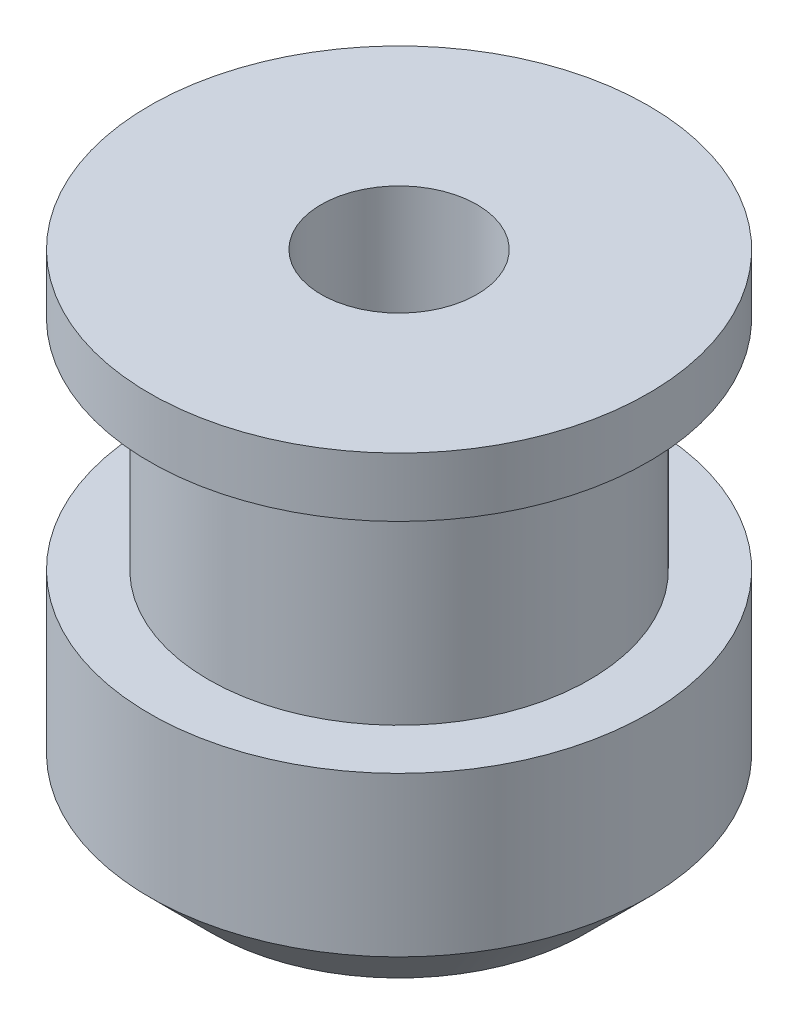
ISO-10303-21;
HEADER;
FILE_DESCRIPTION(('STEP AP214'),'2;1');
FILE_NAME('part.step','',(''),(''),'','','');
FILE_SCHEMA(('AUTOMOTIVE_DESIGN { 1 0 10303 214 1 1 1 1 }'));
ENDSEC;
DATA;
#1=APPLICATION_CONTEXT('core data for automotive mechanical design processes');
#2=APPLICATION_PROTOCOL_DEFINITION('international standard','automotive_design',2000,#1);
#3=PRODUCT_CONTEXT('',#1,'mechanical');
#4=PRODUCT('Part','Part','',(#3));
#5=PRODUCT_RELATED_PRODUCT_CATEGORY('part','',(#4));
#6=PRODUCT_DEFINITION_FORMATION('','',#4);
#7=PRODUCT_DEFINITION_CONTEXT('part definition',#1,'design');
#8=PRODUCT_DEFINITION('design','',#6,#7);
#9=PRODUCT_DEFINITION_SHAPE('','',#8);
#10=(LENGTH_UNIT() NAMED_UNIT(*) SI_UNIT(.MILLI.,.METRE.));
#11=(NAMED_UNIT(*) PLANE_ANGLE_UNIT() SI_UNIT($,.RADIAN.));
#12=(NAMED_UNIT(*) SI_UNIT($,.STERADIAN.) SOLID_ANGLE_UNIT());
#13=UNCERTAINTY_MEASURE_WITH_UNIT(LENGTH_MEASURE(1.E-05),#10,'distance_accuracy_value','');
#14=(GEOMETRIC_REPRESENTATION_CONTEXT(3) GLOBAL_UNCERTAINTY_ASSIGNED_CONTEXT((#13)) GLOBAL_UNIT_ASSIGNED_CONTEXT((#10,
#11,#12)) REPRESENTATION_CONTEXT('',''));
#15=CARTESIAN_POINT('',(0.,0.,0.));
#16=DIRECTION('',(0.,0.,1.));
#17=DIRECTION('',(1.,0.,0.));
#18=AXIS2_PLACEMENT_3D('',#15,#16,#17);
#19=CARTESIAN_POINT('',(0.,0.,0.));
#20=DIRECTION('',(0.,-1.,0.));
#21=DIRECTION('',(0.,0.,-1.));
#22=AXIS2_PLACEMENT_3D('',#19,#20,#21);
#23=CYLINDRICAL_SURFACE('',#22,2.5);
#24=CARTESIAN_POINT('',(0.,0.,0.));
#25=DIRECTION('',(0.,-1.,0.));
#26=DIRECTION('',(0.,0.,-1.));
#27=AXIS2_PLACEMENT_3D('',#24,#25,#26);
#28=CIRCLE('',#27,2.5);
#29=CARTESIAN_POINT('',(0.,0.,-2.5));
#30=VERTEX_POINT('',#29);
#31=EDGE_CURVE('E50',#30,#30,#28,.T.);
#32=ORIENTED_EDGE('',*,*,#31,.T.);
#33=EDGE_LOOP('',(#32));
#34=FACE_BOUND('',#33,.T.);
#35=CARTESIAN_POINT('',(0.,16.,0.));
#36=DIRECTION('',(0.,-1.,0.));
#37=DIRECTION('',(0.,0.,-1.));
#38=AXIS2_PLACEMENT_3D('',#35,#36,#37);
#39=CIRCLE('',#38,2.5);
#40=CARTESIAN_POINT('',(0.,16.,-2.5));
#41=VERTEX_POINT('',#40);
#42=EDGE_CURVE('E71',#41,#41,#39,.T.);
#43=ORIENTED_EDGE('',*,*,#42,.F.);
#44=EDGE_LOOP('',(#43));
#45=FACE_BOUND('',#44,.T.);
#46=ADVANCED_FACE('F38',(#34,#45),#23,.F.);
#47=CARTESIAN_POINT('',(2.5,0.,0.));
#48=DIRECTION('',(0.,-1.,0.));
#49=DIRECTION('',(0.,0.,-1.));
#50=AXIS2_PLACEMENT_3D('',#47,#48,#49);
#51=PLANE('',#50);
#52=CARTESIAN_POINT('',(0.,0.,0.));
#53=DIRECTION('',(0.,-1.,0.));
#54=DIRECTION('',(0.,0.,-1.));
#55=AXIS2_PLACEMENT_3D('',#52,#53,#54);
#56=CIRCLE('',#55,6.00000000000001);
#57=CARTESIAN_POINT('',(0.,0.,-6.00000000000001));
#58=VERTEX_POINT('',#57);
#59=EDGE_CURVE('E46',#58,#58,#56,.T.);
#60=ORIENTED_EDGE('',*,*,#59,.T.);
#61=EDGE_LOOP('',(#60));
#62=FACE_BOUND('',#61,.T.);
#63=ORIENTED_EDGE('',*,*,#31,.F.);
#64=EDGE_LOOP('',(#63));
#65=FACE_BOUND('',#64,.T.);
#66=ADVANCED_FACE('F79',(#62,#65),#51,.T.);
#67=CARTESIAN_POINT('',(0.,0.,0.));
#68=DIRECTION('',(0.,-1.,0.));
#69=DIRECTION('',(0.,0.,-1.));
#70=AXIS2_PLACEMENT_3D('',#67,#68,#69);
#71=CYLINDRICAL_SURFACE('',#70,8.);
#72=CARTESIAN_POINT('',(0.,1.99999999999999,0.));
#73=DIRECTION('',(0.,-1.,0.));
#74=DIRECTION('',(0.,0.,-1.));
#75=AXIS2_PLACEMENT_3D('',#72,#73,#74);
#76=CIRCLE('',#75,8.);
#77=CARTESIAN_POINT('',(0.,1.99999999999999,-8.));
#78=VERTEX_POINT('',#77);
#79=EDGE_CURVE('E10',#78,#78,#76,.F.);
#80=ORIENTED_EDGE('',*,*,#79,.T.);
#81=EDGE_LOOP('',(#80));
#82=FACE_BOUND('',#81,.T.);
#83=CARTESIAN_POINT('',(0.,7.1,0.));
#84=DIRECTION('',(0.,-1.,0.));
#85=DIRECTION('',(0.,0.,-1.));
#86=AXIS2_PLACEMENT_3D('',#83,#84,#85);
#87=CIRCLE('',#86,8.);
#88=CARTESIAN_POINT('',(0.,7.1,-8.));
#89=VERTEX_POINT('',#88);
#90=EDGE_CURVE('E54',#89,#89,#87,.T.);
#91=ORIENTED_EDGE('',*,*,#90,.T.);
#92=EDGE_LOOP('',(#91));
#93=FACE_BOUND('',#92,.T.);
#94=ADVANCED_FACE('F84',(#82,#93),#71,.T.);
#95=CARTESIAN_POINT('',(8.,7.1,0.));
#96=DIRECTION('',(0.,1.,0.));
#97=DIRECTION('',(0.,0.,1.));
#98=AXIS2_PLACEMENT_3D('',#95,#96,#97);
#99=PLANE('',#98);
#100=CARTESIAN_POINT('',(0.,7.1,0.));
#101=DIRECTION('',(0.,-1.,0.));
#102=DIRECTION('',(0.,0.,-1.));
#103=AXIS2_PLACEMENT_3D('',#100,#101,#102);
#104=CIRCLE('',#103,6.11);
#105=CARTESIAN_POINT('',(0.,7.1,-6.11));
#106=VERTEX_POINT('',#105);
#107=EDGE_CURVE('E59',#106,#106,#104,.T.);
#108=ORIENTED_EDGE('',*,*,#107,.T.);
#109=EDGE_LOOP('',(#108));
#110=FACE_BOUND('',#109,.T.);
#111=ORIENTED_EDGE('',*,*,#90,.F.);
#112=EDGE_LOOP('',(#111));
#113=FACE_BOUND('',#112,.T.);
#114=ADVANCED_FACE('F89',(#110,#113),#99,.T.);
#115=CARTESIAN_POINT('',(0.,0.,0.));
#116=DIRECTION('',(0.,-1.,0.));
#117=DIRECTION('',(0.,0.,-1.));
#118=AXIS2_PLACEMENT_3D('',#115,#116,#117);
#119=CYLINDRICAL_SURFACE('',#118,6.11);
#120=CARTESIAN_POINT('',(0.,14.1,0.));
#121=DIRECTION('',(0.,-1.,0.));
#122=DIRECTION('',(0.,0.,-1.));
#123=AXIS2_PLACEMENT_3D('',#120,#121,#122);
#124=CIRCLE('',#123,6.11);
#125=CARTESIAN_POINT('',(0.,14.1,-6.11));
#126=VERTEX_POINT('',#125);
#127=EDGE_CURVE('E62',#126,#126,#124,.T.);
#128=ORIENTED_EDGE('',*,*,#127,.T.);
#129=EDGE_LOOP('',(#128));
#130=FACE_BOUND('',#129,.T.);
#131=ORIENTED_EDGE('',*,*,#107,.F.);
#132=EDGE_LOOP('',(#131));
#133=FACE_BOUND('',#132,.T.);
#134=ADVANCED_FACE('F92',(#130,#133),#119,.T.);
#135=CARTESIAN_POINT('',(6.11,14.1,0.));
#136=DIRECTION('',(0.,-1.,0.));
#137=DIRECTION('',(0.,0.,-1.));
#138=AXIS2_PLACEMENT_3D('',#135,#136,#137);
#139=PLANE('',#138);
#140=CARTESIAN_POINT('',(0.,14.1,0.));
#141=DIRECTION('',(0.,-1.,0.));
#142=DIRECTION('',(0.,0.,-1.));
#143=AXIS2_PLACEMENT_3D('',#140,#141,#142);
#144=CIRCLE('',#143,8.);
#145=CARTESIAN_POINT('',(0.,14.1,-8.));
#146=VERTEX_POINT('',#145);
#147=EDGE_CURVE('E65',#146,#146,#144,.T.);
#148=ORIENTED_EDGE('',*,*,#147,.T.);
#149=EDGE_LOOP('',(#148));
#150=FACE_BOUND('',#149,.T.);
#151=ORIENTED_EDGE('',*,*,#127,.F.);
#152=EDGE_LOOP('',(#151));
#153=FACE_BOUND('',#152,.T.);
#154=ADVANCED_FACE('F96',(#150,#153),#139,.T.);
#155=CARTESIAN_POINT('',(0.,0.,0.));
#156=DIRECTION('',(0.,-1.,0.));
#157=DIRECTION('',(0.,0.,-1.));
#158=AXIS2_PLACEMENT_3D('',#155,#156,#157);
#159=CYLINDRICAL_SURFACE('',#158,8.);
#160=CARTESIAN_POINT('',(0.,16.,0.));
#161=DIRECTION('',(0.,-1.,0.));
#162=DIRECTION('',(0.,0.,-1.));
#163=AXIS2_PLACEMENT_3D('',#160,#161,#162);
#164=CIRCLE('',#163,8.);
#165=CARTESIAN_POINT('',(0.,16.,-8.));
#166=VERTEX_POINT('',#165);
#167=EDGE_CURVE('E68',#166,#166,#164,.T.);
#168=ORIENTED_EDGE('',*,*,#167,.T.);
#169=EDGE_LOOP('',(#168));
#170=FACE_BOUND('',#169,.T.);
#171=ORIENTED_EDGE('',*,*,#147,.F.);
#172=EDGE_LOOP('',(#171));
#173=FACE_BOUND('',#172,.T.);
#174=ADVANCED_FACE('F100',(#170,#173),#159,.T.);
#175=CARTESIAN_POINT('',(8.,16.,0.));
#176=DIRECTION('',(0.,1.,0.));
#177=DIRECTION('',(0.,0.,1.));
#178=AXIS2_PLACEMENT_3D('',#175,#176,#177);
#179=PLANE('',#178);
#180=ORIENTED_EDGE('',*,*,#42,.T.);
#181=EDGE_LOOP('',(#180));
#182=FACE_BOUND('',#181,.T.);
#183=ORIENTED_EDGE('',*,*,#167,.F.);
#184=EDGE_LOOP('',(#183));
#185=FACE_BOUND('',#184,.T.);
#186=ADVANCED_FACE('F75',(#182,#185),#179,.T.);
#187=CARTESIAN_POINT('',(0.,0.,0.));
#188=DIRECTION('',(0.,1.,0.));
#189=DIRECTION('',(0.,0.,1.));
#190=AXIS2_PLACEMENT_3D('',#187,#188,#189);
#191=CONICAL_SURFACE('',#190,6.00000000000001,0.785398163397447);
#192=ORIENTED_EDGE('',*,*,#79,.F.);
#193=EDGE_LOOP('',(#192));
#194=FACE_BOUND('',#193,.T.);
#195=ORIENTED_EDGE('',*,*,#59,.F.);
#196=EDGE_LOOP('',(#195));
#197=FACE_BOUND('',#196,.T.);
#198=ADVANCED_FACE('F41',(#194,#197),#191,.T.);
#199=CLOSED_SHELL('',(#46,#66,#94,#114,#134,#154,#174,#186,#198));
#200=MANIFOLD_SOLID_BREP('B2',#199);
#201=ADVANCED_BREP_SHAPE_REPRESENTATION('',(#18,#200),#14);
#202=SHAPE_DEFINITION_REPRESENTATION(#9,#201);
ENDSEC;
END-ISO-10303-21;
